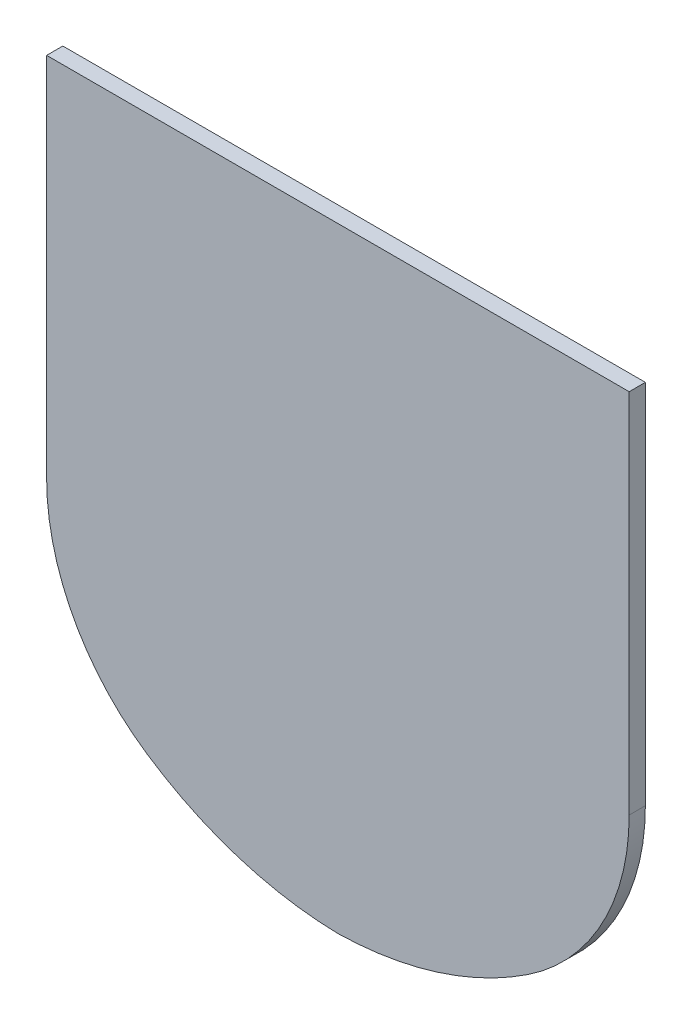
ISO-10303-21;
HEADER;
FILE_DESCRIPTION(('STEP AP214'),'2;1');
FILE_NAME('part.step','',(''),(''),'','','');
FILE_SCHEMA(('AUTOMOTIVE_DESIGN { 1 0 10303 214 1 1 1 1 }'));
ENDSEC;
DATA;
#1=APPLICATION_CONTEXT('core data for automotive mechanical design processes');
#2=APPLICATION_PROTOCOL_DEFINITION('international standard','automotive_design',2000,#1);
#3=PRODUCT_CONTEXT('',#1,'mechanical');
#4=PRODUCT('Part','Part','',(#3));
#5=PRODUCT_RELATED_PRODUCT_CATEGORY('part','',(#4));
#6=PRODUCT_DEFINITION_FORMATION('','',#4);
#7=PRODUCT_DEFINITION_CONTEXT('part definition',#1,'design');
#8=PRODUCT_DEFINITION('design','',#6,#7);
#9=PRODUCT_DEFINITION_SHAPE('','',#8);
#10=(LENGTH_UNIT() NAMED_UNIT(*) SI_UNIT(.MILLI.,.METRE.));
#11=(NAMED_UNIT(*) PLANE_ANGLE_UNIT() SI_UNIT($,.RADIAN.));
#12=(NAMED_UNIT(*) SI_UNIT($,.STERADIAN.) SOLID_ANGLE_UNIT());
#13=UNCERTAINTY_MEASURE_WITH_UNIT(LENGTH_MEASURE(1.E-05),#10,'distance_accuracy_value','');
#14=(GEOMETRIC_REPRESENTATION_CONTEXT(3) GLOBAL_UNCERTAINTY_ASSIGNED_CONTEXT((#13)) GLOBAL_UNIT_ASSIGNED_CONTEXT((#10,
#11,#12)) REPRESENTATION_CONTEXT('',''));
#15=CARTESIAN_POINT('',(0.,0.,0.));
#16=DIRECTION('',(0.,0.,1.));
#17=DIRECTION('',(1.,0.,0.));
#18=AXIS2_PLACEMENT_3D('',#15,#16,#17);
#19=CARTESIAN_POINT('',(0.,0.,0.5));
#20=DIRECTION('',(0.,0.,1.));
#21=DIRECTION('',(1.,0.,0.));
#22=AXIS2_PLACEMENT_3D('',#19,#20,#21);
#23=PLANE('',#22);
#24=DIRECTION('',(0.,-1.,0.));
#25=VECTOR('',#24,1.);
#26=CARTESIAN_POINT('',(-9.,0.,0.5));
#27=LINE('',#26,#25);
#28=CARTESIAN_POINT('',(-9.,52.2153846153846,0.5));
#29=VERTEX_POINT('',#28);
#30=CARTESIAN_POINT('',(-9.,40.8864231507257,0.5));
#31=VERTEX_POINT('',#30);
#32=EDGE_CURVE('E145',#29,#31,#27,.T.);
#33=ORIENTED_EDGE('',*,*,#32,.T.);
#34=CARTESIAN_POINT('',(-2.,40.8864231507257,0.5));
#35=DIRECTION('',(0.,0.,1.));
#36=DIRECTION('',(1.,0.,0.));
#37=AXIS2_PLACEMENT_3D('',#34,#35,#36);
#38=CIRCLE('',#37,7.);
#39=CARTESIAN_POINT('',(-5.88673051108156,35.0646256676259,0.5));
#40=VERTEX_POINT('',#39);
#41=EDGE_CURVE('E126',#31,#40,#38,.T.);
#42=ORIENTED_EDGE('',*,*,#41,.T.);
#43=CARTESIAN_POINT('',(0.220988863475178,44.2131645696399,0.5));
#44=DIRECTION('',(0.,0.,1.));
#45=DIRECTION('',(1.,0.,0.));
#46=AXIS2_PLACEMENT_3D('',#43,#44,#45);
#47=CIRCLE('',#46,11.);
#48=CARTESIAN_POINT('',(0.,33.2153846153846,0.5));
#49=VERTEX_POINT('',#48);
#50=EDGE_CURVE('E124',#40,#49,#47,.T.);
#51=ORIENTED_EDGE('',*,*,#50,.T.);
#52=CARTESIAN_POINT('',(-0.220988863475173,44.2131645696399,0.5));
#53=DIRECTION('',(0.,0.,1.));
#54=DIRECTION('',(1.,0.,0.));
#55=AXIS2_PLACEMENT_3D('',#52,#53,#54);
#56=CIRCLE('',#55,11.);
#57=CARTESIAN_POINT('',(5.88673051108156,35.0646256676259,0.5));
#58=VERTEX_POINT('',#57);
#59=EDGE_CURVE('E113',#58,#49,#56,.F.);
#60=ORIENTED_EDGE('',*,*,#59,.F.);
#61=CARTESIAN_POINT('',(2.,40.8864231507257,0.5));
#62=DIRECTION('',(0.,0.,1.));
#63=DIRECTION('',(1.,0.,0.));
#64=AXIS2_PLACEMENT_3D('',#61,#62,#63);
#65=CIRCLE('',#64,7.);
#66=CARTESIAN_POINT('',(9.00000000000001,40.8864231507257,0.5));
#67=VERTEX_POINT('',#66);
#68=EDGE_CURVE('E158',#58,#67,#65,.T.);
#69=ORIENTED_EDGE('',*,*,#68,.T.);
#70=DIRECTION('',(0.,-1.,0.));
#71=VECTOR('',#70,1.);
#72=CARTESIAN_POINT('',(9.00000000000001,0.,0.5));
#73=LINE('',#72,#71);
#74=CARTESIAN_POINT('',(9.,52.2153846153846,0.5));
#75=VERTEX_POINT('',#74);
#76=EDGE_CURVE('E139',#75,#67,#73,.T.);
#77=ORIENTED_EDGE('',*,*,#76,.F.);
#78=DIRECTION('',(1.,0.,0.));
#79=VECTOR('',#78,1.);
#80=CARTESIAN_POINT('',(0.,52.2153846153846,0.5));
#81=LINE('',#80,#79);
#82=EDGE_CURVE('E141',#29,#75,#81,.T.);
#83=ORIENTED_EDGE('',*,*,#82,.F.);
#84=EDGE_LOOP('',(#33,#42,#51,#60,#69,#77,#83));
#85=FACE_BOUND('',#84,.T.);
#86=ADVANCED_FACE('F53',(#85),#23,.T.);
#87=CARTESIAN_POINT('',(0.,0.,0.));
#88=DIRECTION('',(0.,0.,1.));
#89=DIRECTION('',(1.,0.,0.));
#90=AXIS2_PLACEMENT_3D('',#87,#88,#89);
#91=PLANE('',#90);
#92=CARTESIAN_POINT('',(0.220988863475178,44.2131645696399,0.));
#93=DIRECTION('',(0.,0.,1.));
#94=DIRECTION('',(1.,0.,0.));
#95=AXIS2_PLACEMENT_3D('',#92,#93,#94);
#96=CIRCLE('',#95,11.);
#97=CARTESIAN_POINT('',(-5.88673051108156,35.0646256676259,0.));
#98=VERTEX_POINT('',#97);
#99=CARTESIAN_POINT('',(0.,33.2153846153846,0.));
#100=VERTEX_POINT('',#99);
#101=EDGE_CURVE('E121',#98,#100,#96,.T.);
#102=ORIENTED_EDGE('',*,*,#101,.F.);
#103=CARTESIAN_POINT('',(-2.,40.8864231507257,0.));
#104=DIRECTION('',(0.,0.,1.));
#105=DIRECTION('',(1.,0.,0.));
#106=AXIS2_PLACEMENT_3D('',#103,#104,#105);
#107=CIRCLE('',#106,7.);
#108=CARTESIAN_POINT('',(-9.,40.8864231507257,0.));
#109=VERTEX_POINT('',#108);
#110=EDGE_CURVE('E164',#98,#109,#107,.F.);
#111=ORIENTED_EDGE('',*,*,#110,.T.);
#112=DIRECTION('',(0.,-1.,0.));
#113=VECTOR('',#112,1.);
#114=CARTESIAN_POINT('',(-9.,0.,0.));
#115=LINE('',#114,#113);
#116=CARTESIAN_POINT('',(-9.,52.2153846153846,0.));
#117=VERTEX_POINT('',#116);
#118=EDGE_CURVE('E142',#117,#109,#115,.T.);
#119=ORIENTED_EDGE('',*,*,#118,.F.);
#120=DIRECTION('',(1.,0.,0.));
#121=VECTOR('',#120,1.);
#122=CARTESIAN_POINT('',(0.,52.2153846153846,0.));
#123=LINE('',#122,#121);
#124=CARTESIAN_POINT('',(9.,52.2153846153846,0.));
#125=VERTEX_POINT('',#124);
#126=EDGE_CURVE('E135',#117,#125,#123,.T.);
#127=ORIENTED_EDGE('',*,*,#126,.T.);
#128=DIRECTION('',(0.,-1.,0.));
#129=VECTOR('',#128,1.);
#130=CARTESIAN_POINT('',(9.00000000000001,0.,0.));
#131=LINE('',#130,#129);
#132=CARTESIAN_POINT('',(9.00000000000001,40.8864231507257,0.));
#133=VERTEX_POINT('',#132);
#134=EDGE_CURVE('E133',#125,#133,#131,.T.);
#135=ORIENTED_EDGE('',*,*,#134,.T.);
#136=CARTESIAN_POINT('',(2.,40.8864231507257,0.));
#137=DIRECTION('',(0.,0.,1.));
#138=DIRECTION('',(1.,0.,0.));
#139=AXIS2_PLACEMENT_3D('',#136,#137,#138);
#140=CIRCLE('',#139,7.);
#141=CARTESIAN_POINT('',(5.88673051108156,35.0646256676259,0.));
#142=VERTEX_POINT('',#141);
#143=EDGE_CURVE('E68',#133,#142,#140,.F.);
#144=ORIENTED_EDGE('',*,*,#143,.T.);
#145=CARTESIAN_POINT('',(-0.220988863475173,44.2131645696399,0.));
#146=DIRECTION('',(0.,0.,1.));
#147=DIRECTION('',(1.,0.,0.));
#148=AXIS2_PLACEMENT_3D('',#145,#146,#147);
#149=CIRCLE('',#148,11.);
#150=EDGE_CURVE('E120',#142,#100,#149,.F.);
#151=ORIENTED_EDGE('',*,*,#150,.T.);
#152=EDGE_LOOP('',(#102,#111,#119,#127,#135,#144,#151));
#153=FACE_BOUND('',#152,.T.);
#154=ADVANCED_FACE('F167',(#153),#91,.F.);
#155=CARTESIAN_POINT('',(-9.,0.,0.5));
#156=DIRECTION('',(1.,0.,0.));
#157=DIRECTION('',(0.,0.,-1.));
#158=AXIS2_PLACEMENT_3D('',#155,#156,#157);
#159=PLANE('',#158);
#160=ORIENTED_EDGE('',*,*,#118,.T.);
#161=DIRECTION('',(0.,0.,-1.));
#162=VECTOR('',#161,1.);
#163=CARTESIAN_POINT('',(-9.,40.8864231507257,0.5));
#164=LINE('',#163,#162);
#165=EDGE_CURVE('E155',#109,#31,#164,.F.);
#166=ORIENTED_EDGE('',*,*,#165,.T.);
#167=ORIENTED_EDGE('',*,*,#32,.F.);
#168=DIRECTION('',(0.,0.,-1.));
#169=VECTOR('',#168,1.);
#170=CARTESIAN_POINT('',(-9.,52.2153846153846,0.5));
#171=LINE('',#170,#169);
#172=EDGE_CURVE('E146',#29,#117,#171,.T.);
#173=ORIENTED_EDGE('',*,*,#172,.T.);
#174=EDGE_LOOP('',(#160,#166,#167,#173));
#175=FACE_BOUND('',#174,.T.);
#176=ADVANCED_FACE('F172',(#175),#159,.F.);
#177=CARTESIAN_POINT('',(9.00000000000001,0.,0.5));
#178=DIRECTION('',(1.,0.,0.));
#179=DIRECTION('',(0.,1.,0.));
#180=AXIS2_PLACEMENT_3D('',#177,#178,#179);
#181=PLANE('',#180);
#182=ORIENTED_EDGE('',*,*,#76,.T.);
#183=DIRECTION('',(0.,0.,-1.));
#184=VECTOR('',#183,1.);
#185=CARTESIAN_POINT('',(9.00000000000001,40.8864231507257,0.));
#186=LINE('',#185,#184);
#187=EDGE_CURVE('E12',#67,#133,#186,.T.);
#188=ORIENTED_EDGE('',*,*,#187,.T.);
#189=ORIENTED_EDGE('',*,*,#134,.F.);
#190=DIRECTION('',(0.,0.,-1.));
#191=VECTOR('',#190,1.);
#192=CARTESIAN_POINT('',(9.,52.2153846153846,0.5));
#193=LINE('',#192,#191);
#194=EDGE_CURVE('E153',#75,#125,#193,.T.);
#195=ORIENTED_EDGE('',*,*,#194,.F.);
#196=EDGE_LOOP('',(#182,#188,#189,#195));
#197=FACE_BOUND('',#196,.T.);
#198=ADVANCED_FACE('F193',(#197),#181,.T.);
#199=CARTESIAN_POINT('',(0.,52.2153846153846,0.5));
#200=DIRECTION('',(0.,1.,0.));
#201=DIRECTION('',(0.,0.,1.));
#202=AXIS2_PLACEMENT_3D('',#199,#200,#201);
#203=PLANE('',#202);
#204=ORIENTED_EDGE('',*,*,#126,.F.);
#205=ORIENTED_EDGE('',*,*,#172,.F.);
#206=ORIENTED_EDGE('',*,*,#82,.T.);
#207=ORIENTED_EDGE('',*,*,#194,.T.);
#208=EDGE_LOOP('',(#204,#205,#206,#207));
#209=FACE_BOUND('',#208,.T.);
#210=ADVANCED_FACE('F194',(#209),#203,.T.);
#211=CARTESIAN_POINT('',(-0.220988863475173,44.2131645696399,0.));
#212=DIRECTION('',(0.,0.,1.));
#213=DIRECTION('',(1.,0.,0.));
#214=AXIS2_PLACEMENT_3D('',#211,#212,#213);
#215=CYLINDRICAL_SURFACE('',#214,11.);
#216=ORIENTED_EDGE('',*,*,#150,.F.);
#217=DIRECTION('',(0.,0.,1.));
#218=VECTOR('',#217,1.);
#219=CARTESIAN_POINT('',(5.88673051108156,35.0646256676259,0.));
#220=LINE('',#219,#218);
#221=EDGE_CURVE('E61',#142,#58,#220,.T.);
#222=ORIENTED_EDGE('',*,*,#221,.T.);
#223=ORIENTED_EDGE('',*,*,#59,.T.);
#224=DIRECTION('',(0.,0.,1.));
#225=VECTOR('',#224,1.);
#226=CARTESIAN_POINT('',(0.,33.2153846153846,0.));
#227=LINE('',#226,#225);
#228=EDGE_CURVE('E117',#100,#49,#227,.T.);
#229=ORIENTED_EDGE('',*,*,#228,.F.);
#230=EDGE_LOOP('',(#216,#222,#223,#229));
#231=FACE_BOUND('',#230,.T.);
#232=ADVANCED_FACE('F115',(#231),#215,.T.);
#233=CARTESIAN_POINT('',(0.220988863475178,44.2131645696399,0.));
#234=DIRECTION('',(0.,0.,1.));
#235=DIRECTION('',(1.,0.,0.));
#236=AXIS2_PLACEMENT_3D('',#233,#234,#235);
#237=CYLINDRICAL_SURFACE('',#236,11.);
#238=ORIENTED_EDGE('',*,*,#50,.F.);
#239=DIRECTION('',(0.,0.,1.));
#240=VECTOR('',#239,1.);
#241=CARTESIAN_POINT('',(-5.88673051108156,35.0646256676259,0.));
#242=LINE('',#241,#240);
#243=EDGE_CURVE('E161',#40,#98,#242,.F.);
#244=ORIENTED_EDGE('',*,*,#243,.T.);
#245=ORIENTED_EDGE('',*,*,#101,.T.);
#246=ORIENTED_EDGE('',*,*,#228,.T.);
#247=EDGE_LOOP('',(#238,#244,#245,#246));
#248=FACE_BOUND('',#247,.T.);
#249=ADVANCED_FACE('F131',(#248),#237,.T.);
#250=CARTESIAN_POINT('',(-2.,40.8864231507257,0.));
#251=DIRECTION('',(0.,0.,1.));
#252=DIRECTION('',(1.,0.,0.));
#253=AXIS2_PLACEMENT_3D('',#250,#251,#252);
#254=CYLINDRICAL_SURFACE('',#253,7.);
#255=ORIENTED_EDGE('',*,*,#110,.F.);
#256=ORIENTED_EDGE('',*,*,#243,.F.);
#257=ORIENTED_EDGE('',*,*,#41,.F.);
#258=ORIENTED_EDGE('',*,*,#165,.F.);
#259=EDGE_LOOP('',(#255,#256,#257,#258));
#260=FACE_BOUND('',#259,.T.);
#261=ADVANCED_FACE('F174',(#260),#254,.T.);
#262=CARTESIAN_POINT('',(2.,40.8864231507257,0.));
#263=DIRECTION('',(0.,0.,1.));
#264=DIRECTION('',(1.,0.,0.));
#265=AXIS2_PLACEMENT_3D('',#262,#263,#264);
#266=CYLINDRICAL_SURFACE('',#265,7.);
#267=ORIENTED_EDGE('',*,*,#143,.F.);
#268=ORIENTED_EDGE('',*,*,#187,.F.);
#269=ORIENTED_EDGE('',*,*,#68,.F.);
#270=ORIENTED_EDGE('',*,*,#221,.F.);
#271=EDGE_LOOP('',(#267,#268,#269,#270));
#272=FACE_BOUND('',#271,.T.);
#273=ADVANCED_FACE('F55',(#272),#266,.T.);
#274=CLOSED_SHELL('',(#86,#154,#176,#198,#210,#232,#249,#261,#273));
#275=MANIFOLD_SOLID_BREP('B2',#274);
#276=ADVANCED_BREP_SHAPE_REPRESENTATION('',(#18,#275),#14);
#277=SHAPE_DEFINITION_REPRESENTATION(#9,#276);
ENDSEC;
END-ISO-10303-21;
